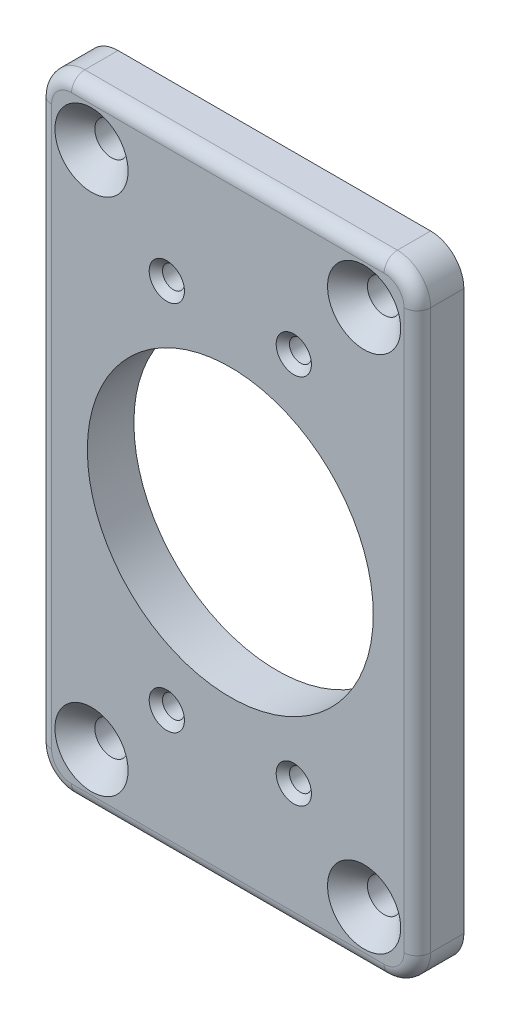
ISO-10303-21;
HEADER;
FILE_DESCRIPTION(('STEP AP214'),'2;1');
FILE_NAME('part.step','',(''),(''),'','','');
FILE_SCHEMA(('AUTOMOTIVE_DESIGN { 1 0 10303 214 1 1 1 1 }'));
ENDSEC;
DATA;
#1=APPLICATION_CONTEXT('core data for automotive mechanical design processes');
#2=APPLICATION_PROTOCOL_DEFINITION('international standard','automotive_design',2000,#1);
#3=PRODUCT_CONTEXT('',#1,'mechanical');
#4=PRODUCT('Part','Part','',(#3));
#5=PRODUCT_RELATED_PRODUCT_CATEGORY('part','',(#4));
#6=PRODUCT_DEFINITION_FORMATION('','',#4);
#7=PRODUCT_DEFINITION_CONTEXT('part definition',#1,'design');
#8=PRODUCT_DEFINITION('design','',#6,#7);
#9=PRODUCT_DEFINITION_SHAPE('','',#8);
#10=(LENGTH_UNIT() NAMED_UNIT(*) SI_UNIT(.MILLI.,.METRE.));
#11=(NAMED_UNIT(*) PLANE_ANGLE_UNIT() SI_UNIT($,.RADIAN.));
#12=(NAMED_UNIT(*) SI_UNIT($,.STERADIAN.) SOLID_ANGLE_UNIT());
#13=UNCERTAINTY_MEASURE_WITH_UNIT(LENGTH_MEASURE(1.E-05),#10,'distance_accuracy_value','');
#14=(GEOMETRIC_REPRESENTATION_CONTEXT(3) GLOBAL_UNCERTAINTY_ASSIGNED_CONTEXT((#13)) GLOBAL_UNIT_ASSIGNED_CONTEXT((#10,
#11,#12)) REPRESENTATION_CONTEXT('',''));
#15=CARTESIAN_POINT('',(0.,0.,0.));
#16=DIRECTION('',(0.,0.,1.));
#17=DIRECTION('',(1.,0.,0.));
#18=AXIS2_PLACEMENT_3D('',#15,#16,#17);
#19=CARTESIAN_POINT('',(0.,10.,7.));
#20=DIRECTION('',(0.,1.,0.));
#21=DIRECTION('',(0.,0.,1.));
#22=AXIS2_PLACEMENT_3D('',#19,#20,#21);
#23=PLANE('',#22);
#24=DIRECTION('',(0.,0.,-1.));
#25=VECTOR('',#24,1.);
#26=CARTESIAN_POINT('',(-42.,10.,7.));
#27=LINE('',#26,#25);
#28=CARTESIAN_POINT('',(-42.,10.,0.));
#29=VERTEX_POINT('',#28);
#30=CARTESIAN_POINT('',(-42.,10.,5.));
#31=VERTEX_POINT('',#30);
#32=EDGE_CURVE('E155',#29,#31,#27,.F.);
#33=ORIENTED_EDGE('',*,*,#32,.T.);
#34=DIRECTION('',(1.,0.,0.));
#35=VECTOR('',#34,1.);
#36=CARTESIAN_POINT('',(0.,10.,5.));
#37=LINE('',#36,#35);
#38=CARTESIAN_POINT('',(5.,10.,5.));
#39=VERTEX_POINT('',#38);
#40=EDGE_CURVE('E238',#31,#39,#37,.T.);
#41=ORIENTED_EDGE('',*,*,#40,.T.);
#42=DIRECTION('',(0.,0.,-1.));
#43=VECTOR('',#42,1.);
#44=CARTESIAN_POINT('',(5.,10.,7.));
#45=LINE('',#44,#43);
#46=CARTESIAN_POINT('',(5.,10.,0.));
#47=VERTEX_POINT('',#46);
#48=EDGE_CURVE('E158',#39,#47,#45,.T.);
#49=ORIENTED_EDGE('',*,*,#48,.T.);
#50=DIRECTION('',(1.,0.,0.));
#51=VECTOR('',#50,1.);
#52=CARTESIAN_POINT('',(0.,10.,0.));
#53=LINE('',#52,#51);
#54=EDGE_CURVE('E143',#29,#47,#53,.T.);
#55=ORIENTED_EDGE('',*,*,#54,.F.);
#56=EDGE_LOOP('',(#33,#41,#49,#55));
#57=FACE_BOUND('',#56,.T.);
#58=ADVANCED_FACE('F44',(#57),#23,.T.);
#59=CARTESIAN_POINT('',(-47.,0.,7.));
#60=DIRECTION('',(1.,0.,0.));
#61=DIRECTION('',(0.,1.,0.));
#62=AXIS2_PLACEMENT_3D('',#59,#60,#61);
#63=PLANE('',#62);
#64=DIRECTION('',(0.,0.,-1.));
#65=VECTOR('',#64,1.);
#66=CARTESIAN_POINT('',(-47.,-79.,7.));
#67=LINE('',#66,#65);
#68=CARTESIAN_POINT('',(-47.,-79.,0.));
#69=VERTEX_POINT('',#68);
#70=CARTESIAN_POINT('',(-47.,-79.,5.));
#71=VERTEX_POINT('',#70);
#72=EDGE_CURVE('E191',#69,#71,#67,.F.);
#73=ORIENTED_EDGE('',*,*,#72,.T.);
#74=DIRECTION('',(0.,-1.,0.));
#75=VECTOR('',#74,1.);
#76=CARTESIAN_POINT('',(-47.,5.,5.));
#77=LINE('',#76,#75);
#78=CARTESIAN_POINT('',(-47.,5.,5.));
#79=VERTEX_POINT('',#78);
#80=EDGE_CURVE('E243',#71,#79,#77,.F.);
#81=ORIENTED_EDGE('',*,*,#80,.T.);
#82=DIRECTION('',(0.,0.,-1.));
#83=VECTOR('',#82,1.);
#84=CARTESIAN_POINT('',(-47.,5.,0.));
#85=LINE('',#84,#83);
#86=CARTESIAN_POINT('',(-47.,5.,0.));
#87=VERTEX_POINT('',#86);
#88=EDGE_CURVE('E194',#79,#87,#85,.T.);
#89=ORIENTED_EDGE('',*,*,#88,.T.);
#90=DIRECTION('',(0.,-1.,0.));
#91=VECTOR('',#90,1.);
#92=CARTESIAN_POINT('',(-47.,0.,0.));
#93=LINE('',#92,#91);
#94=EDGE_CURVE('E145',#87,#69,#93,.T.);
#95=ORIENTED_EDGE('',*,*,#94,.T.);
#96=EDGE_LOOP('',(#73,#81,#89,#95));
#97=FACE_BOUND('',#96,.T.);
#98=ADVANCED_FACE('F327',(#97),#63,.F.);
#99=CARTESIAN_POINT('',(0.,-84.,7.));
#100=DIRECTION('',(0.,1.,0.));
#101=DIRECTION('',(0.,0.,1.));
#102=AXIS2_PLACEMENT_3D('',#99,#100,#101);
#103=PLANE('',#102);
#104=DIRECTION('',(0.,0.,-1.));
#105=VECTOR('',#104,1.);
#106=CARTESIAN_POINT('',(5.00000000000002,-84.,7.));
#107=LINE('',#106,#105);
#108=CARTESIAN_POINT('',(5.00000000000002,-84.,0.));
#109=VERTEX_POINT('',#108);
#110=CARTESIAN_POINT('',(5.00000000000002,-84.,5.));
#111=VERTEX_POINT('',#110);
#112=EDGE_CURVE('E197',#109,#111,#107,.F.);
#113=ORIENTED_EDGE('',*,*,#112,.T.);
#114=DIRECTION('',(1.,0.,0.));
#115=VECTOR('',#114,1.);
#116=CARTESIAN_POINT('',(-42.,-84.,5.));
#117=LINE('',#116,#115);
#118=CARTESIAN_POINT('',(-42.,-84.,5.));
#119=VERTEX_POINT('',#118);
#120=EDGE_CURVE('E62',#111,#119,#117,.F.);
#121=ORIENTED_EDGE('',*,*,#120,.T.);
#122=DIRECTION('',(0.,0.,-1.));
#123=VECTOR('',#122,1.);
#124=CARTESIAN_POINT('',(-42.,-84.,7.));
#125=LINE('',#124,#123);
#126=CARTESIAN_POINT('',(-42.,-84.,0.));
#127=VERTEX_POINT('',#126);
#128=EDGE_CURVE('E200',#119,#127,#125,.T.);
#129=ORIENTED_EDGE('',*,*,#128,.T.);
#130=DIRECTION('',(1.,0.,0.));
#131=VECTOR('',#130,1.);
#132=CARTESIAN_POINT('',(0.,-84.,0.));
#133=LINE('',#132,#131);
#134=EDGE_CURVE('E452',#127,#109,#133,.T.);
#135=ORIENTED_EDGE('',*,*,#134,.T.);
#136=EDGE_LOOP('',(#113,#121,#129,#135));
#137=FACE_BOUND('',#136,.T.);
#138=ADVANCED_FACE('F332',(#137),#103,.F.);
#139=CARTESIAN_POINT('',(2.00000000000003,2.0375,7.));
#140=DIRECTION('',(0.,0.,-1.));
#141=DIRECTION('',(-1.,0.,0.));
#142=AXIS2_PLACEMENT_3D('',#139,#140,#141);
#143=CYLINDRICAL_SURFACE('',#142,2.5);
#144=CARTESIAN_POINT('',(2.00000000000003,2.0375,3.99999999999998));
#145=DIRECTION('',(0.,0.,1.));
#146=DIRECTION('',(1.,0.,0.));
#147=AXIS2_PLACEMENT_3D('',#144,#145,#146);
#148=CIRCLE('',#147,2.5);
#149=CARTESIAN_POINT('',(4.50000000000003,2.0375,3.99999999999998));
#150=VERTEX_POINT('',#149);
#151=EDGE_CURVE('E491',#150,#150,#148,.T.);
#152=ORIENTED_EDGE('',*,*,#151,.T.);
#153=EDGE_LOOP('',(#152));
#154=FACE_BOUND('',#153,.T.);
#155=CARTESIAN_POINT('',(2.00000000000003,2.0375,0.));
#156=DIRECTION('',(0.,0.,1.));
#157=DIRECTION('',(1.,0.,0.));
#158=AXIS2_PLACEMENT_3D('',#155,#156,#157);
#159=CIRCLE('',#158,2.5);
#160=CARTESIAN_POINT('',(4.50000000000003,2.0375,0.));
#161=VERTEX_POINT('',#160);
#162=EDGE_CURVE('E467',#161,#161,#159,.F.);
#163=ORIENTED_EDGE('',*,*,#162,.T.);
#164=EDGE_LOOP('',(#163));
#165=FACE_BOUND('',#164,.T.);
#166=ADVANCED_FACE('F539',(#154,#165),#143,.F.);
#167=CARTESIAN_POINT('',(-39.,-76.0375,7.));
#168=DIRECTION('',(0.,0.,-1.));
#169=DIRECTION('',(-1.,0.,0.));
#170=AXIS2_PLACEMENT_3D('',#167,#168,#169);
#171=CYLINDRICAL_SURFACE('',#170,2.5);
#172=CARTESIAN_POINT('',(-39.,-76.0375,3.99999999999998));
#173=DIRECTION('',(0.,0.,1.));
#174=DIRECTION('',(1.,0.,0.));
#175=AXIS2_PLACEMENT_3D('',#172,#173,#174);
#176=CIRCLE('',#175,2.5);
#177=CARTESIAN_POINT('',(-36.5,-76.0375,3.99999999999998));
#178=VERTEX_POINT('',#177);
#179=EDGE_CURVE('E174',#178,#178,#176,.T.);
#180=ORIENTED_EDGE('',*,*,#179,.T.);
#181=EDGE_LOOP('',(#180));
#182=FACE_BOUND('',#181,.T.);
#183=CARTESIAN_POINT('',(-39.,-76.0375,0.));
#184=DIRECTION('',(0.,0.,1.));
#185=DIRECTION('',(1.,0.,0.));
#186=AXIS2_PLACEMENT_3D('',#183,#184,#185);
#187=CIRCLE('',#186,2.5);
#188=CARTESIAN_POINT('',(-36.5,-76.0375,0.));
#189=VERTEX_POINT('',#188);
#190=EDGE_CURVE('E463',#189,#189,#187,.F.);
#191=ORIENTED_EDGE('',*,*,#190,.T.);
#192=EDGE_LOOP('',(#191));
#193=FACE_BOUND('',#192,.T.);
#194=ADVANCED_FACE('F502',(#182,#193),#171,.F.);
#195=CARTESIAN_POINT('',(2.00000000000003,-76.0375,7.));
#196=DIRECTION('',(0.,0.,-1.));
#197=DIRECTION('',(-1.,0.,0.));
#198=AXIS2_PLACEMENT_3D('',#195,#196,#197);
#199=CYLINDRICAL_SURFACE('',#198,2.5);
#200=CARTESIAN_POINT('',(2.00000000000003,-76.0375,3.99999999999999));
#201=DIRECTION('',(0.,0.,1.));
#202=DIRECTION('',(1.,0.,0.));
#203=AXIS2_PLACEMENT_3D('',#200,#201,#202);
#204=CIRCLE('',#203,2.5);
#205=CARTESIAN_POINT('',(4.50000000000003,-76.0375,3.99999999999999));
#206=VERTEX_POINT('',#205);
#207=EDGE_CURVE('E167',#206,#206,#204,.T.);
#208=ORIENTED_EDGE('',*,*,#207,.T.);
#209=EDGE_LOOP('',(#208));
#210=FACE_BOUND('',#209,.T.);
#211=CARTESIAN_POINT('',(2.00000000000003,-76.0375,0.));
#212=DIRECTION('',(0.,0.,1.));
#213=DIRECTION('',(1.,0.,0.));
#214=AXIS2_PLACEMENT_3D('',#211,#212,#213);
#215=CIRCLE('',#214,2.5);
#216=CARTESIAN_POINT('',(4.50000000000003,-76.0375,0.));
#217=VERTEX_POINT('',#216);
#218=EDGE_CURVE('E459',#217,#217,#215,.T.);
#219=ORIENTED_EDGE('',*,*,#218,.F.);
#220=EDGE_LOOP('',(#219));
#221=FACE_BOUND('',#220,.T.);
#222=ADVANCED_FACE('F516',(#210,#221),#199,.F.);
#223=CARTESIAN_POINT('',(-8.575,-9.35000000000001,7.));
#224=DIRECTION('',(0.,0.,-1.));
#225=DIRECTION('',(-1.,0.,0.));
#226=AXIS2_PLACEMENT_3D('',#223,#224,#225);
#227=CYLINDRICAL_SURFACE('',#226,1.65);
#228=CARTESIAN_POINT('',(-8.575,-9.35000000000001,5.99999999999998));
#229=DIRECTION('',(0.,0.,1.));
#230=DIRECTION('',(1.,0.,0.));
#231=AXIS2_PLACEMENT_3D('',#228,#229,#230);
#232=CIRCLE('',#231,1.65);
#233=CARTESIAN_POINT('',(-6.925,-9.35000000000001,5.99999999999998));
#234=VERTEX_POINT('',#233);
#235=EDGE_CURVE('E55',#234,#234,#232,.T.);
#236=ORIENTED_EDGE('',*,*,#235,.T.);
#237=EDGE_LOOP('',(#236));
#238=FACE_BOUND('',#237,.T.);
#239=CARTESIAN_POINT('',(-8.575,-9.35000000000001,0.));
#240=DIRECTION('',(0.,0.,1.));
#241=DIRECTION('',(1.,0.,0.));
#242=AXIS2_PLACEMENT_3D('',#239,#240,#241);
#243=CIRCLE('',#242,1.65);
#244=CARTESIAN_POINT('',(-6.925,-9.35000000000001,0.));
#245=VERTEX_POINT('',#244);
#246=EDGE_CURVE('E449',#245,#245,#243,.T.);
#247=ORIENTED_EDGE('',*,*,#246,.F.);
#248=EDGE_LOOP('',(#247));
#249=FACE_BOUND('',#248,.T.);
#250=ADVANCED_FACE('F308',(#238,#249),#227,.F.);
#251=CARTESIAN_POINT('',(-27.675,-65.25,7.));
#252=DIRECTION('',(0.,0.,-1.));
#253=DIRECTION('',(-1.,0.,0.));
#254=AXIS2_PLACEMENT_3D('',#251,#252,#253);
#255=CYLINDRICAL_SURFACE('',#254,1.65);
#256=CARTESIAN_POINT('',(-27.675,-65.25,5.99999999999998));
#257=DIRECTION('',(0.,0.,1.));
#258=DIRECTION('',(1.,0.,0.));
#259=AXIS2_PLACEMENT_3D('',#256,#257,#258);
#260=CIRCLE('',#259,1.65);
#261=CARTESIAN_POINT('',(-26.025,-65.25,5.99999999999998));
#262=VERTEX_POINT('',#261);
#263=EDGE_CURVE('E300',#262,#262,#260,.T.);
#264=ORIENTED_EDGE('',*,*,#263,.T.);
#265=EDGE_LOOP('',(#264));
#266=FACE_BOUND('',#265,.T.);
#267=CARTESIAN_POINT('',(-27.675,-65.25,0.));
#268=DIRECTION('',(0.,0.,1.));
#269=DIRECTION('',(1.,0.,0.));
#270=AXIS2_PLACEMENT_3D('',#267,#268,#269);
#271=CIRCLE('',#270,1.65);
#272=CARTESIAN_POINT('',(-26.025,-65.25,0.));
#273=VERTEX_POINT('',#272);
#274=EDGE_CURVE('E443',#273,#273,#271,.T.);
#275=ORIENTED_EDGE('',*,*,#274,.F.);
#276=EDGE_LOOP('',(#275));
#277=FACE_BOUND('',#276,.T.);
#278=ADVANCED_FACE('F437',(#266,#277),#255,.F.);
#279=CARTESIAN_POINT('',(-8.57500000000001,-65.25,7.));
#280=DIRECTION('',(0.,0.,-1.));
#281=DIRECTION('',(-1.,0.,0.));
#282=AXIS2_PLACEMENT_3D('',#279,#280,#281);
#283=CYLINDRICAL_SURFACE('',#282,1.65);
#284=CARTESIAN_POINT('',(-8.57500000000001,-65.25,5.99999999999998));
#285=DIRECTION('',(0.,0.,1.));
#286=DIRECTION('',(1.,0.,0.));
#287=AXIS2_PLACEMENT_3D('',#284,#285,#286);
#288=CIRCLE('',#287,1.65);
#289=CARTESIAN_POINT('',(-6.92500000000001,-65.25,5.99999999999998));
#290=VERTEX_POINT('',#289);
#291=EDGE_CURVE('E250',#290,#290,#288,.T.);
#292=ORIENTED_EDGE('',*,*,#291,.T.);
#293=EDGE_LOOP('',(#292));
#294=FACE_BOUND('',#293,.T.);
#295=CARTESIAN_POINT('',(-8.57500000000001,-65.25,0.));
#296=DIRECTION('',(0.,0.,1.));
#297=DIRECTION('',(1.,0.,0.));
#298=AXIS2_PLACEMENT_3D('',#295,#296,#297);
#299=CIRCLE('',#298,1.65);
#300=CARTESIAN_POINT('',(-6.92500000000001,-65.25,0.));
#301=VERTEX_POINT('',#300);
#302=EDGE_CURVE('E441',#301,#301,#299,.T.);
#303=ORIENTED_EDGE('',*,*,#302,.F.);
#304=EDGE_LOOP('',(#303));
#305=FACE_BOUND('',#304,.T.);
#306=ADVANCED_FACE('F434',(#294,#305),#283,.F.);
#307=CARTESIAN_POINT('',(10.,0.,7.));
#308=DIRECTION('',(1.,0.,0.));
#309=DIRECTION('',(0.,1.,0.));
#310=AXIS2_PLACEMENT_3D('',#307,#308,#309);
#311=PLANE('',#310);
#312=DIRECTION('',(0.,0.,-1.));
#313=VECTOR('',#312,1.);
#314=CARTESIAN_POINT('',(10.,5.,7.));
#315=LINE('',#314,#313);
#316=CARTESIAN_POINT('',(10.,5.,0.));
#317=VERTEX_POINT('',#316);
#318=CARTESIAN_POINT('',(10.,5.,5.));
#319=VERTEX_POINT('',#318);
#320=EDGE_CURVE('E187',#317,#319,#315,.F.);
#321=ORIENTED_EDGE('',*,*,#320,.T.);
#322=DIRECTION('',(0.,-1.,0.));
#323=VECTOR('',#322,1.);
#324=CARTESIAN_POINT('',(10.,0.,5.));
#325=LINE('',#324,#323);
#326=CARTESIAN_POINT('',(10.,-79.,5.));
#327=VERTEX_POINT('',#326);
#328=EDGE_CURVE('E232',#319,#327,#325,.T.);
#329=ORIENTED_EDGE('',*,*,#328,.T.);
#330=DIRECTION('',(0.,0.,-1.));
#331=VECTOR('',#330,1.);
#332=CARTESIAN_POINT('',(10.,-79.,0.));
#333=LINE('',#332,#331);
#334=CARTESIAN_POINT('',(10.,-79.,0.));
#335=VERTEX_POINT('',#334);
#336=EDGE_CURVE('E184',#327,#335,#333,.T.);
#337=ORIENTED_EDGE('',*,*,#336,.T.);
#338=DIRECTION('',(0.,-1.,0.));
#339=VECTOR('',#338,1.);
#340=CARTESIAN_POINT('',(10.,0.,0.));
#341=LINE('',#340,#339);
#342=EDGE_CURVE('E444',#317,#335,#341,.T.);
#343=ORIENTED_EDGE('',*,*,#342,.F.);
#344=EDGE_LOOP('',(#321,#329,#337,#343));
#345=FACE_BOUND('',#344,.T.);
#346=ADVANCED_FACE('F341',(#345),#311,.T.);
#347=CARTESIAN_POINT('',(-27.675,-9.35000000000001,7.));
#348=DIRECTION('',(0.,0.,-1.));
#349=DIRECTION('',(-1.,0.,0.));
#350=AXIS2_PLACEMENT_3D('',#347,#348,#349);
#351=CYLINDRICAL_SURFACE('',#350,1.65);
#352=CARTESIAN_POINT('',(-27.675,-9.35000000000001,5.99999999999998));
#353=DIRECTION('',(0.,0.,1.));
#354=DIRECTION('',(1.,0.,0.));
#355=AXIS2_PLACEMENT_3D('',#352,#353,#354);
#356=CIRCLE('',#355,1.65);
#357=CARTESIAN_POINT('',(-26.025,-9.35000000000001,5.99999999999998));
#358=VERTEX_POINT('',#357);
#359=EDGE_CURVE('E11',#358,#358,#356,.T.);
#360=ORIENTED_EDGE('',*,*,#359,.T.);
#361=EDGE_LOOP('',(#360));
#362=FACE_BOUND('',#361,.T.);
#363=CARTESIAN_POINT('',(-27.675,-9.35000000000001,0.));
#364=DIRECTION('',(0.,0.,1.));
#365=DIRECTION('',(1.,0.,0.));
#366=AXIS2_PLACEMENT_3D('',#363,#364,#365);
#367=CIRCLE('',#366,1.65);
#368=CARTESIAN_POINT('',(-26.025,-9.35000000000001,0.));
#369=VERTEX_POINT('',#368);
#370=EDGE_CURVE('E161',#369,#369,#367,.T.);
#371=ORIENTED_EDGE('',*,*,#370,.F.);
#372=EDGE_LOOP('',(#371));
#373=FACE_BOUND('',#372,.T.);
#374=ADVANCED_FACE('F337',(#362,#373),#351,.F.);
#375=CARTESIAN_POINT('',(-39.,2.0375,7.));
#376=DIRECTION('',(0.,0.,-1.));
#377=DIRECTION('',(-1.,0.,0.));
#378=AXIS2_PLACEMENT_3D('',#375,#376,#377);
#379=CYLINDRICAL_SURFACE('',#378,2.5);
#380=CARTESIAN_POINT('',(-39.,2.0375,3.99999999999999));
#381=DIRECTION('',(0.,0.,1.));
#382=DIRECTION('',(1.,0.,0.));
#383=AXIS2_PLACEMENT_3D('',#380,#381,#382);
#384=CIRCLE('',#383,2.5);
#385=CARTESIAN_POINT('',(-36.5,2.0375,3.99999999999999));
#386=VERTEX_POINT('',#385);
#387=EDGE_CURVE('E495',#386,#386,#384,.T.);
#388=ORIENTED_EDGE('',*,*,#387,.T.);
#389=EDGE_LOOP('',(#388));
#390=FACE_BOUND('',#389,.T.);
#391=CARTESIAN_POINT('',(-39.,2.0375,0.));
#392=DIRECTION('',(0.,0.,1.));
#393=DIRECTION('',(1.,0.,0.));
#394=AXIS2_PLACEMENT_3D('',#391,#392,#393);
#395=CIRCLE('',#394,2.5);
#396=CARTESIAN_POINT('',(-36.5,2.0375,0.));
#397=VERTEX_POINT('',#396);
#398=EDGE_CURVE('E471',#397,#397,#395,.T.);
#399=ORIENTED_EDGE('',*,*,#398,.F.);
#400=EDGE_LOOP('',(#399));
#401=FACE_BOUND('',#400,.T.);
#402=ADVANCED_FACE('F340',(#390,#401),#379,.F.);
#403=CARTESIAN_POINT('',(0.,0.,7.));
#404=DIRECTION('',(0.,0.,1.));
#405=DIRECTION('',(1.,0.,0.));
#406=AXIS2_PLACEMENT_3D('',#403,#404,#405);
#407=PLANE('',#406);
#408=CARTESIAN_POINT('',(-18.125,-37.3,7.));
#409=DIRECTION('',(0.,0.,1.));
#410=DIRECTION('',(1.,0.,0.));
#411=AXIS2_PLACEMENT_3D('',#408,#409,#410);
#412=CIRCLE('',#411,21.5);
#413=CARTESIAN_POINT('',(3.375,-37.3,7.));
#414=VERTEX_POINT('',#413);
#415=EDGE_CURVE('E592',#414,#414,#412,.T.);
#416=ORIENTED_EDGE('',*,*,#415,.F.);
#417=EDGE_LOOP('',(#416));
#418=FACE_BOUND('',#417,.T.);
#419=CARTESIAN_POINT('',(-8.57500000000001,-65.25,7.));
#420=DIRECTION('',(0.,0.,1.));
#421=DIRECTION('',(1.,0.,0.));
#422=AXIS2_PLACEMENT_3D('',#419,#420,#421);
#423=CIRCLE('',#422,2.65000000000003);
#424=CARTESIAN_POINT('',(-5.92499999999998,-65.25,7.));
#425=VERTEX_POINT('',#424);
#426=EDGE_CURVE('E296',#425,#425,#423,.F.);
#427=ORIENTED_EDGE('',*,*,#426,.T.);
#428=EDGE_LOOP('',(#427));
#429=FACE_BOUND('',#428,.T.);
#430=CARTESIAN_POINT('',(-27.675,-65.25,7.));
#431=DIRECTION('',(0.,0.,1.));
#432=DIRECTION('',(1.,0.,0.));
#433=AXIS2_PLACEMENT_3D('',#430,#431,#432);
#434=CIRCLE('',#433,2.65000000000003);
#435=CARTESIAN_POINT('',(-25.025,-65.25,7.));
#436=VERTEX_POINT('',#435);
#437=EDGE_CURVE('E292',#436,#436,#434,.F.);
#438=ORIENTED_EDGE('',*,*,#437,.T.);
#439=EDGE_LOOP('',(#438));
#440=FACE_BOUND('',#439,.T.);
#441=CARTESIAN_POINT('',(-8.575,-9.35000000000001,7.));
#442=DIRECTION('',(0.,0.,1.));
#443=DIRECTION('',(1.,0.,0.));
#444=AXIS2_PLACEMENT_3D('',#441,#442,#443);
#445=CIRCLE('',#444,2.65000000000003);
#446=CARTESIAN_POINT('',(-5.92499999999997,-9.35000000000001,7.));
#447=VERTEX_POINT('',#446);
#448=EDGE_CURVE('E288',#447,#447,#445,.F.);
#449=ORIENTED_EDGE('',*,*,#448,.T.);
#450=EDGE_LOOP('',(#449));
#451=FACE_BOUND('',#450,.T.);
#452=CARTESIAN_POINT('',(-27.675,-9.35000000000001,7.));
#453=DIRECTION('',(0.,0.,1.));
#454=DIRECTION('',(1.,0.,0.));
#455=AXIS2_PLACEMENT_3D('',#452,#453,#454);
#456=CIRCLE('',#455,2.65000000000003);
#457=CARTESIAN_POINT('',(-25.025,-9.35000000000001,7.));
#458=VERTEX_POINT('',#457);
#459=EDGE_CURVE('E284',#458,#458,#456,.F.);
#460=ORIENTED_EDGE('',*,*,#459,.T.);
#461=EDGE_LOOP('',(#460));
#462=FACE_BOUND('',#461,.T.);
#463=DIRECTION('',(1.,0.,0.));
#464=VECTOR('',#463,1.);
#465=CARTESIAN_POINT('',(5.00000000000002,-82.,7.));
#466=LINE('',#465,#464);
#467=CARTESIAN_POINT('',(-42.,-82.,7.));
#468=VERTEX_POINT('',#467);
#469=CARTESIAN_POINT('',(5.00000000000002,-82.,7.));
#470=VERTEX_POINT('',#469);
#471=EDGE_CURVE('E203',#468,#470,#466,.T.);
#472=ORIENTED_EDGE('',*,*,#471,.T.);
#473=CARTESIAN_POINT('',(5.00000000000002,-79.,7.));
#474=DIRECTION('',(0.,0.,1.));
#475=DIRECTION('',(1.,0.,0.));
#476=AXIS2_PLACEMENT_3D('',#473,#474,#475);
#477=CIRCLE('',#476,3.);
#478=CARTESIAN_POINT('',(8.00000000000002,-79.,7.));
#479=VERTEX_POINT('',#478);
#480=EDGE_CURVE('E224',#470,#479,#477,.T.);
#481=ORIENTED_EDGE('',*,*,#480,.T.);
#482=DIRECTION('',(0.,-1.,0.));
#483=VECTOR('',#482,1.);
#484=CARTESIAN_POINT('',(8.,0.,7.));
#485=LINE('',#484,#483);
#486=CARTESIAN_POINT('',(8.,5.,7.));
#487=VERTEX_POINT('',#486);
#488=EDGE_CURVE('E221',#479,#487,#485,.F.);
#489=ORIENTED_EDGE('',*,*,#488,.T.);
#490=CARTESIAN_POINT('',(5.,5.,7.));
#491=DIRECTION('',(0.,0.,1.));
#492=DIRECTION('',(1.,0.,0.));
#493=AXIS2_PLACEMENT_3D('',#490,#491,#492);
#494=CIRCLE('',#493,3.);
#495=CARTESIAN_POINT('',(5.,8.,7.));
#496=VERTEX_POINT('',#495);
#497=EDGE_CURVE('E218',#487,#496,#494,.T.);
#498=ORIENTED_EDGE('',*,*,#497,.T.);
#499=DIRECTION('',(1.,0.,0.));
#500=VECTOR('',#499,1.);
#501=CARTESIAN_POINT('',(0.,8.,7.));
#502=LINE('',#501,#500);
#503=CARTESIAN_POINT('',(-42.,8.,7.));
#504=VERTEX_POINT('',#503);
#505=EDGE_CURVE('E215',#496,#504,#502,.F.);
#506=ORIENTED_EDGE('',*,*,#505,.T.);
#507=CARTESIAN_POINT('',(-42.,5.,7.));
#508=DIRECTION('',(0.,0.,1.));
#509=DIRECTION('',(1.,0.,0.));
#510=AXIS2_PLACEMENT_3D('',#507,#508,#509);
#511=CIRCLE('',#510,3.);
#512=CARTESIAN_POINT('',(-45.,5.,7.));
#513=VERTEX_POINT('',#512);
#514=EDGE_CURVE('E212',#504,#513,#511,.T.);
#515=ORIENTED_EDGE('',*,*,#514,.T.);
#516=DIRECTION('',(0.,-1.,0.));
#517=VECTOR('',#516,1.);
#518=CARTESIAN_POINT('',(-45.,-79.,7.));
#519=LINE('',#518,#517);
#520=CARTESIAN_POINT('',(-45.,-79.,7.));
#521=VERTEX_POINT('',#520);
#522=EDGE_CURVE('E209',#513,#521,#519,.T.);
#523=ORIENTED_EDGE('',*,*,#522,.T.);
#524=CARTESIAN_POINT('',(-42.,-79.,7.));
#525=DIRECTION('',(0.,0.,1.));
#526=DIRECTION('',(1.,0.,0.));
#527=AXIS2_PLACEMENT_3D('',#524,#525,#526);
#528=CIRCLE('',#527,3.);
#529=EDGE_CURVE('E206',#521,#468,#528,.T.);
#530=ORIENTED_EDGE('',*,*,#529,.T.);
#531=EDGE_LOOP('',(#472,#481,#489,#498,#506,#515,#523,#530));
#532=FACE_BOUND('',#531,.T.);
#533=CARTESIAN_POINT('',(2.00000000000003,2.0375,7.));
#534=DIRECTION('',(0.,0.,1.));
#535=DIRECTION('',(1.,0.,0.));
#536=AXIS2_PLACEMENT_3D('',#533,#534,#535);
#537=CIRCLE('',#536,5.50000000000002);
#538=CARTESIAN_POINT('',(7.50000000000005,2.0375,7.));
#539=VERTEX_POINT('',#538);
#540=EDGE_CURVE('E487',#539,#539,#537,.F.);
#541=ORIENTED_EDGE('',*,*,#540,.T.);
#542=EDGE_LOOP('',(#541));
#543=FACE_BOUND('',#542,.T.);
#544=CARTESIAN_POINT('',(-39.,2.0375,7.));
#545=DIRECTION('',(0.,0.,1.));
#546=DIRECTION('',(1.,0.,0.));
#547=AXIS2_PLACEMENT_3D('',#544,#545,#546);
#548=CIRCLE('',#547,5.50000000000003);
#549=CARTESIAN_POINT('',(-33.5,2.0375,7.));
#550=VERTEX_POINT('',#549);
#551=EDGE_CURVE('E483',#550,#550,#548,.F.);
#552=ORIENTED_EDGE('',*,*,#551,.T.);
#553=EDGE_LOOP('',(#552));
#554=FACE_BOUND('',#553,.T.);
#555=CARTESIAN_POINT('',(-39.,-76.0375,7.));
#556=DIRECTION('',(0.,0.,1.));
#557=DIRECTION('',(1.,0.,0.));
#558=AXIS2_PLACEMENT_3D('',#555,#556,#557);
#559=CIRCLE('',#558,5.50000000000001);
#560=CARTESIAN_POINT('',(-33.5,-76.0375,7.));
#561=VERTEX_POINT('',#560);
#562=EDGE_CURVE('E479',#561,#561,#559,.F.);
#563=ORIENTED_EDGE('',*,*,#562,.T.);
#564=EDGE_LOOP('',(#563));
#565=FACE_BOUND('',#564,.T.);
#566=CARTESIAN_POINT('',(2.00000000000003,-76.0375,7.));
#567=DIRECTION('',(0.,0.,1.));
#568=DIRECTION('',(1.,0.,0.));
#569=AXIS2_PLACEMENT_3D('',#566,#567,#568);
#570=CIRCLE('',#569,5.50000000000003);
#571=CARTESIAN_POINT('',(7.50000000000006,-76.0375,7.));
#572=VERTEX_POINT('',#571);
#573=EDGE_CURVE('E475',#572,#572,#570,.F.);
#574=ORIENTED_EDGE('',*,*,#573,.T.);
#575=EDGE_LOOP('',(#574));
#576=FACE_BOUND('',#575,.T.);
#577=ADVANCED_FACE('F507',(#418,#429,#440,#451,#462,#532,#543,#554,#565,#576),#407,.T.);
#578=CARTESIAN_POINT('',(0.,0.,0.));
#579=DIRECTION('',(0.,0.,1.));
#580=DIRECTION('',(1.,0.,0.));
#581=AXIS2_PLACEMENT_3D('',#578,#579,#580);
#582=PLANE('',#581);
#583=CARTESIAN_POINT('',(-18.125,-37.3,0.));
#584=DIRECTION('',(0.,0.,1.));
#585=DIRECTION('',(1.,0.,0.));
#586=AXIS2_PLACEMENT_3D('',#583,#584,#585);
#587=CIRCLE('',#586,21.5);
#588=CARTESIAN_POINT('',(3.375,-37.3,0.));
#589=VERTEX_POINT('',#588);
#590=EDGE_CURVE('E49',#589,#589,#587,.T.);
#591=ORIENTED_EDGE('',*,*,#590,.T.);
#592=EDGE_LOOP('',(#591));
#593=FACE_BOUND('',#592,.T.);
#594=ORIENTED_EDGE('',*,*,#370,.T.);
#595=EDGE_LOOP('',(#594));
#596=FACE_BOUND('',#595,.T.);
#597=ORIENTED_EDGE('',*,*,#54,.T.);
#598=CARTESIAN_POINT('',(5.,5.,0.));
#599=DIRECTION('',(0.,0.,1.));
#600=DIRECTION('',(1.,0.,0.));
#601=AXIS2_PLACEMENT_3D('',#598,#599,#600);
#602=CIRCLE('',#601,5.);
#603=EDGE_CURVE('E150',#47,#317,#602,.F.);
#604=ORIENTED_EDGE('',*,*,#603,.T.);
#605=ORIENTED_EDGE('',*,*,#342,.T.);
#606=CARTESIAN_POINT('',(5.00000000000002,-79.,0.));
#607=DIRECTION('',(0.,0.,1.));
#608=DIRECTION('',(1.,0.,0.));
#609=AXIS2_PLACEMENT_3D('',#606,#607,#608);
#610=CIRCLE('',#609,5.);
#611=EDGE_CURVE('E171',#335,#109,#610,.F.);
#612=ORIENTED_EDGE('',*,*,#611,.T.);
#613=ORIENTED_EDGE('',*,*,#134,.F.);
#614=CARTESIAN_POINT('',(-42.,-79.,0.));
#615=DIRECTION('',(0.,0.,1.));
#616=DIRECTION('',(1.,0.,0.));
#617=AXIS2_PLACEMENT_3D('',#614,#615,#616);
#618=CIRCLE('',#617,5.);
#619=EDGE_CURVE('E151',#127,#69,#618,.F.);
#620=ORIENTED_EDGE('',*,*,#619,.T.);
#621=ORIENTED_EDGE('',*,*,#94,.F.);
#622=CARTESIAN_POINT('',(-42.,5.,0.));
#623=DIRECTION('',(0.,0.,1.));
#624=DIRECTION('',(1.,0.,0.));
#625=AXIS2_PLACEMENT_3D('',#622,#623,#624);
#626=CIRCLE('',#625,5.);
#627=EDGE_CURVE('E139',#87,#29,#626,.F.);
#628=ORIENTED_EDGE('',*,*,#627,.T.);
#629=EDGE_LOOP('',(#597,#604,#605,#612,#613,#620,#621,#628));
#630=FACE_BOUND('',#629,.T.);
#631=ORIENTED_EDGE('',*,*,#302,.T.);
#632=EDGE_LOOP('',(#631));
#633=FACE_BOUND('',#632,.T.);
#634=ORIENTED_EDGE('',*,*,#274,.T.);
#635=EDGE_LOOP('',(#634));
#636=FACE_BOUND('',#635,.T.);
#637=ORIENTED_EDGE('',*,*,#246,.T.);
#638=EDGE_LOOP('',(#637));
#639=FACE_BOUND('',#638,.T.);
#640=ORIENTED_EDGE('',*,*,#218,.T.);
#641=EDGE_LOOP('',(#640));
#642=FACE_BOUND('',#641,.T.);
#643=ORIENTED_EDGE('',*,*,#190,.F.);
#644=EDGE_LOOP('',(#643));
#645=FACE_BOUND('',#644,.T.);
#646=ORIENTED_EDGE('',*,*,#162,.F.);
#647=EDGE_LOOP('',(#646));
#648=FACE_BOUND('',#647,.T.);
#649=ORIENTED_EDGE('',*,*,#398,.T.);
#650=EDGE_LOOP('',(#649));
#651=FACE_BOUND('',#650,.T.);
#652=ADVANCED_FACE('F141',(#593,#596,#630,#633,#636,#639,#642,#645,#648,#651),#582,.F.);
#653=CARTESIAN_POINT('',(2.00000000000003,2.0375,7.));
#654=DIRECTION('',(0.,0.,1.));
#655=DIRECTION('',(1.,0.,0.));
#656=AXIS2_PLACEMENT_3D('',#653,#654,#655);
#657=CONICAL_SURFACE('',#656,5.50000000000002,0.785398163397447);
#658=ORIENTED_EDGE('',*,*,#151,.F.);
#659=EDGE_LOOP('',(#658));
#660=FACE_BOUND('',#659,.T.);
#661=ORIENTED_EDGE('',*,*,#540,.F.);
#662=EDGE_LOOP('',(#661));
#663=FACE_BOUND('',#662,.T.);
#664=ADVANCED_FACE('F344',(#660,#663),#657,.F.);
#665=CARTESIAN_POINT('',(-39.,2.0375,3.99999999999999));
#666=DIRECTION('',(0.,0.,1.));
#667=DIRECTION('',(1.,0.,0.));
#668=AXIS2_PLACEMENT_3D('',#665,#666,#667);
#669=CONICAL_SURFACE('',#668,2.5,0.785398163397451);
#670=ORIENTED_EDGE('',*,*,#551,.F.);
#671=EDGE_LOOP('',(#670));
#672=FACE_BOUND('',#671,.T.);
#673=ORIENTED_EDGE('',*,*,#387,.F.);
#674=EDGE_LOOP('',(#673));
#675=FACE_BOUND('',#674,.T.);
#676=ADVANCED_FACE('F350',(#672,#675),#669,.F.);
#677=CARTESIAN_POINT('',(-39.,-76.0375,7.));
#678=DIRECTION('',(0.,0.,1.));
#679=DIRECTION('',(1.,0.,0.));
#680=AXIS2_PLACEMENT_3D('',#677,#678,#679);
#681=CONICAL_SURFACE('',#680,5.50000000000001,0.785398163397446);
#682=ORIENTED_EDGE('',*,*,#179,.F.);
#683=EDGE_LOOP('',(#682));
#684=FACE_BOUND('',#683,.T.);
#685=ORIENTED_EDGE('',*,*,#562,.F.);
#686=EDGE_LOOP('',(#685));
#687=FACE_BOUND('',#686,.T.);
#688=ADVANCED_FACE('F357',(#684,#687),#681,.F.);
#689=CARTESIAN_POINT('',(2.00000000000003,-76.0375,3.99999999999999));
#690=DIRECTION('',(0.,0.,1.));
#691=DIRECTION('',(1.,0.,0.));
#692=AXIS2_PLACEMENT_3D('',#689,#690,#691);
#693=CONICAL_SURFACE('',#692,2.5,0.785398163397451);
#694=ORIENTED_EDGE('',*,*,#573,.F.);
#695=EDGE_LOOP('',(#694));
#696=FACE_BOUND('',#695,.T.);
#697=ORIENTED_EDGE('',*,*,#207,.F.);
#698=EDGE_LOOP('',(#697));
#699=FACE_BOUND('',#698,.T.);
#700=ADVANCED_FACE('F364',(#696,#699),#693,.F.);
#701=CARTESIAN_POINT('',(5.,5.,7.));
#702=DIRECTION('',(0.,0.,-1.));
#703=DIRECTION('',(-1.,0.,0.));
#704=AXIS2_PLACEMENT_3D('',#701,#702,#703);
#705=CYLINDRICAL_SURFACE('',#704,5.);
#706=ORIENTED_EDGE('',*,*,#48,.F.);
#707=CARTESIAN_POINT('',(5.,5.,5.));
#708=DIRECTION('',(0.,0.,1.));
#709=DIRECTION('',(1.,0.,0.));
#710=AXIS2_PLACEMENT_3D('',#707,#708,#709);
#711=CIRCLE('',#710,5.);
#712=EDGE_CURVE('E235',#39,#319,#711,.F.);
#713=ORIENTED_EDGE('',*,*,#712,.T.);
#714=ORIENTED_EDGE('',*,*,#320,.F.);
#715=ORIENTED_EDGE('',*,*,#603,.F.);
#716=EDGE_LOOP('',(#706,#713,#714,#715));
#717=FACE_BOUND('',#716,.T.);
#718=ADVANCED_FACE('F371',(#717),#705,.T.);
#719=CARTESIAN_POINT('',(-42.,5.,7.));
#720=DIRECTION('',(0.,0.,1.));
#721=DIRECTION('',(1.,0.,0.));
#722=AXIS2_PLACEMENT_3D('',#719,#720,#721);
#723=CYLINDRICAL_SURFACE('',#722,5.);
#724=ORIENTED_EDGE('',*,*,#88,.F.);
#725=CARTESIAN_POINT('',(-42.,5.,5.));
#726=DIRECTION('',(0.,0.,1.));
#727=DIRECTION('',(1.,0.,0.));
#728=AXIS2_PLACEMENT_3D('',#725,#726,#727);
#729=CIRCLE('',#728,5.);
#730=EDGE_CURVE('E165',#79,#31,#729,.F.);
#731=ORIENTED_EDGE('',*,*,#730,.T.);
#732=ORIENTED_EDGE('',*,*,#32,.F.);
#733=ORIENTED_EDGE('',*,*,#627,.F.);
#734=EDGE_LOOP('',(#724,#731,#732,#733));
#735=FACE_BOUND('',#734,.T.);
#736=ADVANCED_FACE('F163',(#735),#723,.T.);
#737=CARTESIAN_POINT('',(-42.,-79.,7.));
#738=DIRECTION('',(0.,0.,-1.));
#739=DIRECTION('',(-1.,0.,0.));
#740=AXIS2_PLACEMENT_3D('',#737,#738,#739);
#741=CYLINDRICAL_SURFACE('',#740,5.);
#742=ORIENTED_EDGE('',*,*,#128,.F.);
#743=CARTESIAN_POINT('',(-42.,-79.,5.));
#744=DIRECTION('',(0.,0.,1.));
#745=DIRECTION('',(1.,0.,0.));
#746=AXIS2_PLACEMENT_3D('',#743,#744,#745);
#747=CIRCLE('',#746,5.);
#748=EDGE_CURVE('E69',#119,#71,#747,.F.);
#749=ORIENTED_EDGE('',*,*,#748,.T.);
#750=ORIENTED_EDGE('',*,*,#72,.F.);
#751=ORIENTED_EDGE('',*,*,#619,.F.);
#752=EDGE_LOOP('',(#742,#749,#750,#751));
#753=FACE_BOUND('',#752,.T.);
#754=ADVANCED_FACE('F378',(#753),#741,.T.);
#755=CARTESIAN_POINT('',(5.00000000000002,-79.,7.));
#756=DIRECTION('',(0.,0.,1.));
#757=DIRECTION('',(1.,0.,0.));
#758=AXIS2_PLACEMENT_3D('',#755,#756,#757);
#759=CYLINDRICAL_SURFACE('',#758,5.);
#760=ORIENTED_EDGE('',*,*,#336,.F.);
#761=CARTESIAN_POINT('',(5.00000000000002,-79.,5.));
#762=DIRECTION('',(0.,0.,1.));
#763=DIRECTION('',(1.,0.,0.));
#764=AXIS2_PLACEMENT_3D('',#761,#762,#763);
#765=CIRCLE('',#764,5.);
#766=EDGE_CURVE('E228',#327,#111,#765,.F.);
#767=ORIENTED_EDGE('',*,*,#766,.T.);
#768=ORIENTED_EDGE('',*,*,#112,.F.);
#769=ORIENTED_EDGE('',*,*,#611,.F.);
#770=EDGE_LOOP('',(#760,#767,#768,#769));
#771=FACE_BOUND('',#770,.T.);
#772=ADVANCED_FACE('F381',(#771),#759,.T.);
#773=CARTESIAN_POINT('',(-42.,5.,5.));
#774=DIRECTION('',(0.,0.,1.));
#775=DIRECTION('',(1.,0.,0.));
#776=AXIS2_PLACEMENT_3D('',#773,#774,#775);
#777=TOROIDAL_SURFACE('',#776,3.,2.);
#778=CARTESIAN_POINT('',(-42.,8.,5.));
#779=DIRECTION('',(1.,0.,0.));
#780=DIRECTION('',(0.,0.,-1.));
#781=AXIS2_PLACEMENT_3D('',#778,#779,#780);
#782=CIRCLE('',#781,2.);
#783=EDGE_CURVE('E273',#31,#504,#782,.T.);
#784=ORIENTED_EDGE('',*,*,#783,.F.);
#785=ORIENTED_EDGE('',*,*,#730,.F.);
#786=CARTESIAN_POINT('',(-45.,5.,5.));
#787=DIRECTION('',(0.,-1.,0.));
#788=DIRECTION('',(0.,0.,-1.));
#789=AXIS2_PLACEMENT_3D('',#786,#787,#788);
#790=CIRCLE('',#789,2.);
#791=EDGE_CURVE('E277',#513,#79,#790,.T.);
#792=ORIENTED_EDGE('',*,*,#791,.F.);
#793=ORIENTED_EDGE('',*,*,#514,.F.);
#794=EDGE_LOOP('',(#784,#785,#792,#793));
#795=FACE_BOUND('',#794,.T.);
#796=ADVANCED_FACE('F384',(#795),#777,.T.);
#797=CARTESIAN_POINT('',(-45.,0.,5.));
#798=DIRECTION('',(0.,1.,0.));
#799=DIRECTION('',(-1.,0.,0.));
#800=AXIS2_PLACEMENT_3D('',#797,#798,#799);
#801=CYLINDRICAL_SURFACE('',#800,2.);
#802=ORIENTED_EDGE('',*,*,#791,.T.);
#803=ORIENTED_EDGE('',*,*,#80,.F.);
#804=CARTESIAN_POINT('',(-45.,-79.,5.));
#805=DIRECTION('',(0.,-1.,0.));
#806=DIRECTION('',(0.,0.,-1.));
#807=AXIS2_PLACEMENT_3D('',#804,#805,#806);
#808=CIRCLE('',#807,2.);
#809=EDGE_CURVE('E269',#521,#71,#808,.T.);
#810=ORIENTED_EDGE('',*,*,#809,.F.);
#811=ORIENTED_EDGE('',*,*,#522,.F.);
#812=EDGE_LOOP('',(#802,#803,#810,#811));
#813=FACE_BOUND('',#812,.T.);
#814=ADVANCED_FACE('F409',(#813),#801,.T.);
#815=CARTESIAN_POINT('',(0.,8.,5.));
#816=DIRECTION('',(1.,0.,0.));
#817=DIRECTION('',(0.,0.,-1.));
#818=AXIS2_PLACEMENT_3D('',#815,#816,#817);
#819=CYLINDRICAL_SURFACE('',#818,2.);
#820=ORIENTED_EDGE('',*,*,#783,.T.);
#821=ORIENTED_EDGE('',*,*,#505,.F.);
#822=CARTESIAN_POINT('',(5.,8.,5.));
#823=DIRECTION('',(1.,0.,0.));
#824=DIRECTION('',(0.,0.,-1.));
#825=AXIS2_PLACEMENT_3D('',#822,#823,#824);
#826=CIRCLE('',#825,2.);
#827=EDGE_CURVE('E265',#39,#496,#826,.T.);
#828=ORIENTED_EDGE('',*,*,#827,.F.);
#829=ORIENTED_EDGE('',*,*,#40,.F.);
#830=EDGE_LOOP('',(#820,#821,#828,#829));
#831=FACE_BOUND('',#830,.T.);
#832=ADVANCED_FACE('F405',(#831),#819,.T.);
#833=CARTESIAN_POINT('',(-42.,-79.,5.));
#834=DIRECTION('',(0.,0.,1.));
#835=DIRECTION('',(1.,0.,0.));
#836=AXIS2_PLACEMENT_3D('',#833,#834,#835);
#837=TOROIDAL_SURFACE('',#836,3.,2.);
#838=ORIENTED_EDGE('',*,*,#809,.T.);
#839=ORIENTED_EDGE('',*,*,#748,.F.);
#840=CARTESIAN_POINT('',(-42.,-82.,5.));
#841=DIRECTION('',(1.,0.,0.));
#842=DIRECTION('',(0.,0.,-1.));
#843=AXIS2_PLACEMENT_3D('',#840,#841,#842);
#844=CIRCLE('',#843,2.);
#845=EDGE_CURVE('E261',#468,#119,#844,.T.);
#846=ORIENTED_EDGE('',*,*,#845,.F.);
#847=ORIENTED_EDGE('',*,*,#529,.F.);
#848=EDGE_LOOP('',(#838,#839,#846,#847));
#849=FACE_BOUND('',#848,.T.);
#850=ADVANCED_FACE('F401',(#849),#837,.T.);
#851=CARTESIAN_POINT('',(5.,5.,5.));
#852=DIRECTION('',(0.,0.,1.));
#853=DIRECTION('',(1.,0.,0.));
#854=AXIS2_PLACEMENT_3D('',#851,#852,#853);
#855=TOROIDAL_SURFACE('',#854,3.,2.);
#856=ORIENTED_EDGE('',*,*,#827,.T.);
#857=ORIENTED_EDGE('',*,*,#497,.F.);
#858=CARTESIAN_POINT('',(8.,5.,5.));
#859=DIRECTION('',(0.,-1.,0.));
#860=DIRECTION('',(1.,0.,0.));
#861=AXIS2_PLACEMENT_3D('',#858,#859,#860);
#862=CIRCLE('',#861,2.);
#863=EDGE_CURVE('E257',#319,#487,#862,.T.);
#864=ORIENTED_EDGE('',*,*,#863,.F.);
#865=ORIENTED_EDGE('',*,*,#712,.F.);
#866=EDGE_LOOP('',(#856,#857,#864,#865));
#867=FACE_BOUND('',#866,.T.);
#868=ADVANCED_FACE('F397',(#867),#855,.T.);
#869=CARTESIAN_POINT('',(0.,-82.,5.));
#870=DIRECTION('',(-1.,0.,0.));
#871=DIRECTION('',(0.,0.,1.));
#872=AXIS2_PLACEMENT_3D('',#869,#870,#871);
#873=CYLINDRICAL_SURFACE('',#872,2.);
#874=ORIENTED_EDGE('',*,*,#845,.T.);
#875=ORIENTED_EDGE('',*,*,#120,.F.);
#876=CARTESIAN_POINT('',(5.00000000000002,-82.,5.));
#877=DIRECTION('',(1.,0.,0.));
#878=DIRECTION('',(0.,0.,-1.));
#879=AXIS2_PLACEMENT_3D('',#876,#877,#878);
#880=CIRCLE('',#879,2.);
#881=EDGE_CURVE('E254',#470,#111,#880,.T.);
#882=ORIENTED_EDGE('',*,*,#881,.F.);
#883=ORIENTED_EDGE('',*,*,#471,.F.);
#884=EDGE_LOOP('',(#874,#875,#882,#883));
#885=FACE_BOUND('',#884,.T.);
#886=ADVANCED_FACE('F393',(#885),#873,.T.);
#887=CARTESIAN_POINT('',(8.,0.,5.));
#888=DIRECTION('',(0.,-1.,0.));
#889=DIRECTION('',(1.,0.,0.));
#890=AXIS2_PLACEMENT_3D('',#887,#888,#889);
#891=CYLINDRICAL_SURFACE('',#890,2.);
#892=ORIENTED_EDGE('',*,*,#863,.T.);
#893=ORIENTED_EDGE('',*,*,#488,.F.);
#894=CARTESIAN_POINT('',(8.00000000000002,-79.,5.));
#895=DIRECTION('',(0.,-1.,0.));
#896=DIRECTION('',(0.,0.,-1.));
#897=AXIS2_PLACEMENT_3D('',#894,#895,#896);
#898=CIRCLE('',#897,2.);
#899=EDGE_CURVE('E251',#327,#479,#898,.T.);
#900=ORIENTED_EDGE('',*,*,#899,.F.);
#901=ORIENTED_EDGE('',*,*,#328,.F.);
#902=EDGE_LOOP('',(#892,#893,#900,#901));
#903=FACE_BOUND('',#902,.T.);
#904=ADVANCED_FACE('F389',(#903),#891,.T.);
#905=CARTESIAN_POINT('',(5.00000000000002,-79.,5.));
#906=DIRECTION('',(0.,0.,1.));
#907=DIRECTION('',(1.,0.,0.));
#908=AXIS2_PLACEMENT_3D('',#905,#906,#907);
#909=TOROIDAL_SURFACE('',#908,3.,2.);
#910=ORIENTED_EDGE('',*,*,#881,.T.);
#911=ORIENTED_EDGE('',*,*,#766,.F.);
#912=ORIENTED_EDGE('',*,*,#899,.T.);
#913=ORIENTED_EDGE('',*,*,#480,.F.);
#914=EDGE_LOOP('',(#910,#911,#912,#913));
#915=FACE_BOUND('',#914,.T.);
#916=ADVANCED_FACE('F386',(#915),#909,.T.);
#917=CARTESIAN_POINT('',(-8.57500000000001,-65.25,5.99999999999998));
#918=DIRECTION('',(0.,0.,1.));
#919=DIRECTION('',(1.,0.,0.));
#920=AXIS2_PLACEMENT_3D('',#917,#918,#919);
#921=CONICAL_SURFACE('',#920,1.65,0.785398163397452);
#922=ORIENTED_EDGE('',*,*,#426,.F.);
#923=EDGE_LOOP('',(#922));
#924=FACE_BOUND('',#923,.T.);
#925=ORIENTED_EDGE('',*,*,#291,.F.);
#926=EDGE_LOOP('',(#925));
#927=FACE_BOUND('',#926,.T.);
#928=ADVANCED_FACE('F321',(#924,#927),#921,.F.);
#929=CARTESIAN_POINT('',(-27.675,-65.25,5.99999999999998));
#930=DIRECTION('',(0.,0.,1.));
#931=DIRECTION('',(1.,0.,0.));
#932=AXIS2_PLACEMENT_3D('',#929,#930,#931);
#933=CONICAL_SURFACE('',#932,1.65,0.785398163397452);
#934=ORIENTED_EDGE('',*,*,#437,.F.);
#935=EDGE_LOOP('',(#934));
#936=FACE_BOUND('',#935,.T.);
#937=ORIENTED_EDGE('',*,*,#263,.F.);
#938=EDGE_LOOP('',(#937));
#939=FACE_BOUND('',#938,.T.);
#940=ADVANCED_FACE('F313',(#936,#939),#933,.F.);
#941=CARTESIAN_POINT('',(-8.575,-9.35000000000001,5.99999999999998));
#942=DIRECTION('',(0.,0.,1.));
#943=DIRECTION('',(1.,0.,0.));
#944=AXIS2_PLACEMENT_3D('',#941,#942,#943);
#945=CONICAL_SURFACE('',#944,1.65,0.785398163397452);
#946=ORIENTED_EDGE('',*,*,#448,.F.);
#947=EDGE_LOOP('',(#946));
#948=FACE_BOUND('',#947,.T.);
#949=ORIENTED_EDGE('',*,*,#235,.F.);
#950=EDGE_LOOP('',(#949));
#951=FACE_BOUND('',#950,.T.);
#952=ADVANCED_FACE('F311',(#948,#951),#945,.F.);
#953=CARTESIAN_POINT('',(-27.675,-9.35000000000001,5.99999999999998));
#954=DIRECTION('',(0.,0.,1.));
#955=DIRECTION('',(1.,0.,0.));
#956=AXIS2_PLACEMENT_3D('',#953,#954,#955);
#957=CONICAL_SURFACE('',#956,1.65,0.785398163397452);
#958=ORIENTED_EDGE('',*,*,#459,.F.);
#959=EDGE_LOOP('',(#958));
#960=FACE_BOUND('',#959,.T.);
#961=ORIENTED_EDGE('',*,*,#359,.F.);
#962=EDGE_LOOP('',(#961));
#963=FACE_BOUND('',#962,.T.);
#964=ADVANCED_FACE('F47',(#960,#963),#957,.F.);
#965=CARTESIAN_POINT('',(-18.125,-37.3,-3.));
#966=DIRECTION('',(0.,0.,1.));
#967=DIRECTION('',(1.,0.,0.));
#968=AXIS2_PLACEMENT_3D('',#965,#966,#967);
#969=CYLINDRICAL_SURFACE('',#968,21.5);
#970=ORIENTED_EDGE('',*,*,#415,.T.);
#971=EDGE_LOOP('',(#970));
#972=FACE_BOUND('',#971,.T.);
#973=ORIENTED_EDGE('',*,*,#590,.F.);
#974=EDGE_LOOP('',(#973));
#975=FACE_BOUND('',#974,.T.);
#976=ADVANCED_FACE('F319',(#972,#975),#969,.F.);
#977=CLOSED_SHELL('',(#58,#98,#138,#166,#194,#222,#250,#278,#306,#346,#374,#402,#577,#652,#664,
#676,#688,#700,#718,#736,#754,#772,#796,#814,#832,#850,#868,#886,#904,#916,#928,#940,#952,#964,#976));
#978=MANIFOLD_SOLID_BREP('B2',#977);
#979=ADVANCED_BREP_SHAPE_REPRESENTATION('',(#18,#978),#14);
#980=SHAPE_DEFINITION_REPRESENTATION(#9,#979);
ENDSEC;
END-ISO-10303-21;
